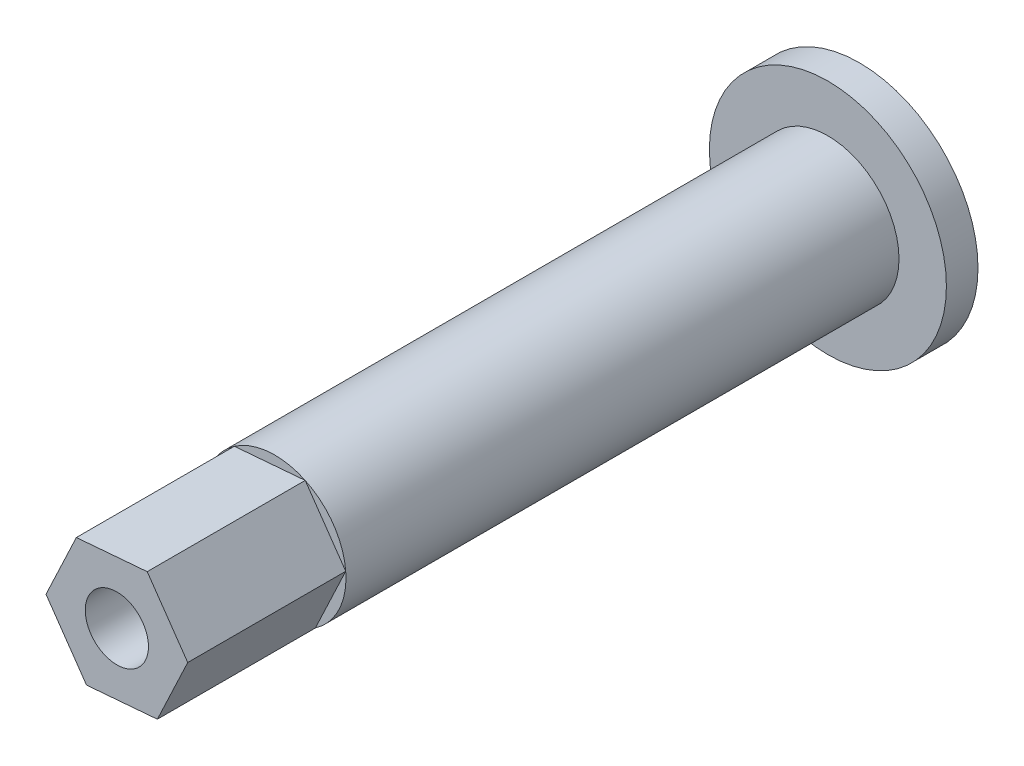
ISO-10303-21;
HEADER;
FILE_DESCRIPTION(('STEP AP214'),'2;1');
FILE_NAME('part.step','',(''),(''),'','','');
FILE_SCHEMA(('AUTOMOTIVE_DESIGN { 1 0 10303 214 1 1 1 1 }'));
ENDSEC;
DATA;
#1=APPLICATION_CONTEXT('core data for automotive mechanical design processes');
#2=APPLICATION_PROTOCOL_DEFINITION('international standard','automotive_design',2000,#1);
#3=PRODUCT_CONTEXT('',#1,'mechanical');
#4=PRODUCT('Part','Part','',(#3));
#5=PRODUCT_RELATED_PRODUCT_CATEGORY('part','',(#4));
#6=PRODUCT_DEFINITION_FORMATION('','',#4);
#7=PRODUCT_DEFINITION_CONTEXT('part definition',#1,'design');
#8=PRODUCT_DEFINITION('design','',#6,#7);
#9=PRODUCT_DEFINITION_SHAPE('','',#8);
#10=(LENGTH_UNIT() NAMED_UNIT(*) SI_UNIT(.MILLI.,.METRE.));
#11=(NAMED_UNIT(*) PLANE_ANGLE_UNIT() SI_UNIT($,.RADIAN.));
#12=(NAMED_UNIT(*) SI_UNIT($,.STERADIAN.) SOLID_ANGLE_UNIT());
#13=UNCERTAINTY_MEASURE_WITH_UNIT(LENGTH_MEASURE(1.E-05),#10,'distance_accuracy_value','');
#14=(GEOMETRIC_REPRESENTATION_CONTEXT(3) GLOBAL_UNCERTAINTY_ASSIGNED_CONTEXT((#13)) GLOBAL_UNIT_ASSIGNED_CONTEXT((#10,
#11,#12)) REPRESENTATION_CONTEXT('',''));
#15=CARTESIAN_POINT('',(0.,0.,0.));
#16=DIRECTION('',(0.,0.,1.));
#17=DIRECTION('',(1.,0.,0.));
#18=AXIS2_PLACEMENT_3D('',#15,#16,#17);
#19=CARTESIAN_POINT('',(0.,0.,35.));
#20=DIRECTION('',(0.,0.,1.));
#21=DIRECTION('',(1.,0.,0.));
#22=AXIS2_PLACEMENT_3D('',#19,#20,#21);
#23=PLANE('',#22);
#24=DIRECTION('',(-0.569748496318656,0.821819110840476,0.));
#25=VECTOR('',#24,1.);
#26=CARTESIAN_POINT('',(4.48465713958224,0.371282022718662,35.));
#27=LINE('',#26,#25);
#28=CARTESIAN_POINT('',(4.48465713958224,0.371282022718665,35.));
#29=VERTEX_POINT('',#28);
#30=CARTESIAN_POINT('',(1.92078890614829,4.0694680215008,35.));
#31=VERTEX_POINT('',#30);
#32=EDGE_CURVE('E147',#29,#31,#27,.T.);
#33=ORIENTED_EDGE('',*,*,#32,.F.);
#34=CARTESIAN_POINT('',(0.,0.,35.));
#35=DIRECTION('',(0.,0.,1.));
#36=DIRECTION('',(1.,0.,0.));
#37=AXIS2_PLACEMENT_3D('',#34,#35,#36);
#38=CIRCLE('',#37,4.5);
#39=EDGE_CURVE('E155',#29,#31,#38,.T.);
#40=ORIENTED_EDGE('',*,*,#39,.T.);
#41=EDGE_LOOP('',(#33,#40));
#42=FACE_BOUND('',#41,.T.);
#43=ADVANCED_FACE('F43',(#42),#23,.T.);
#44=DIRECTION('',(0.426841979144064,0.904326227000179,0.));
#45=VECTOR('',#44,1.);
#46=CARTESIAN_POINT('',(2.56386823343395,-3.69818599878214,35.));
#47=LINE('',#46,#45);
#48=CARTESIAN_POINT('',(2.56386823343395,-3.69818599878214,35.));
#49=VERTEX_POINT('',#48);
#50=EDGE_CURVE('E58',#49,#29,#47,.T.);
#51=ORIENTED_EDGE('',*,*,#50,.F.);
#52=EDGE_CURVE('E149',#49,#29,#38,.T.);
#53=ORIENTED_EDGE('',*,*,#52,.T.);
#54=EDGE_LOOP('',(#51,#53));
#55=FACE_BOUND('',#54,.T.);
#56=ADVANCED_FACE('F243',(#55),#23,.T.);
#57=DIRECTION('',(0.99659047546272,0.0825071161597027,0.));
#58=VECTOR('',#57,1.);
#59=CARTESIAN_POINT('',(-1.92078890614828,-4.0694680215008,35.));
#60=LINE('',#59,#58);
#61=CARTESIAN_POINT('',(-1.92078890614828,-4.06946802150081,35.));
#62=VERTEX_POINT('',#61);
#63=EDGE_CURVE('E65',#62,#49,#60,.T.);
#64=ORIENTED_EDGE('',*,*,#63,.F.);
#65=EDGE_CURVE('E153',#62,#49,#38,.T.);
#66=ORIENTED_EDGE('',*,*,#65,.T.);
#67=EDGE_LOOP('',(#64,#66));
#68=FACE_BOUND('',#67,.T.);
#69=ADVANCED_FACE('F248',(#68),#23,.T.);
#70=DIRECTION('',(0.569748496318656,-0.821819110840476,0.));
#71=VECTOR('',#70,1.);
#72=CARTESIAN_POINT('',(-4.48465713958223,-0.371282022718662,35.));
#73=LINE('',#72,#71);
#74=CARTESIAN_POINT('',(-4.48465713958224,-0.371282022718668,35.));
#75=VERTEX_POINT('',#74);
#76=EDGE_CURVE('E288',#75,#62,#73,.T.);
#77=ORIENTED_EDGE('',*,*,#76,.F.);
#78=EDGE_CURVE('E277',#75,#62,#38,.T.);
#79=ORIENTED_EDGE('',*,*,#78,.T.);
#80=EDGE_LOOP('',(#77,#79));
#81=FACE_BOUND('',#80,.T.);
#82=ADVANCED_FACE('F238',(#81),#23,.T.);
#83=DIRECTION('',(-0.426841979144064,-0.904326227000179,0.));
#84=VECTOR('',#83,1.);
#85=CARTESIAN_POINT('',(-2.56386823343395,3.69818599878214,35.));
#86=LINE('',#85,#84);
#87=CARTESIAN_POINT('',(-2.56386823343395,3.69818599878214,35.));
#88=VERTEX_POINT('',#87);
#89=EDGE_CURVE('E262',#88,#75,#86,.T.);
#90=ORIENTED_EDGE('',*,*,#89,.F.);
#91=EDGE_CURVE('E269',#88,#75,#38,.T.);
#92=ORIENTED_EDGE('',*,*,#91,.T.);
#93=EDGE_LOOP('',(#90,#92));
#94=FACE_BOUND('',#93,.T.);
#95=ADVANCED_FACE('F233',(#94),#23,.T.);
#96=CARTESIAN_POINT('',(0.,0.,10.));
#97=DIRECTION('',(0.,0.,-1.));
#98=DIRECTION('',(-1.,0.,0.));
#99=AXIS2_PLACEMENT_3D('',#96,#97,#98);
#100=CYLINDRICAL_SURFACE('',#99,2.7);
#101=DIRECTION('',(0.,0.,-1.));
#102=VECTOR('',#101,1.);
#103=CARTESIAN_POINT('',(-1.85,1.96659604392971,10.));
#104=LINE('',#103,#102);
#105=CARTESIAN_POINT('',(-1.85,1.96659604392971,10.));
#106=VERTEX_POINT('',#105);
#107=CARTESIAN_POINT('',(-1.85,1.96659604392971,-2.));
#108=VERTEX_POINT('',#107);
#109=EDGE_CURVE('E201',#106,#108,#104,.T.);
#110=ORIENTED_EDGE('',*,*,#109,.T.);
#111=CARTESIAN_POINT('',(0.,0.,-2.));
#112=DIRECTION('',(0.,0.,-1.));
#113=DIRECTION('',(-1.,0.,0.));
#114=AXIS2_PLACEMENT_3D('',#111,#112,#113);
#115=CIRCLE('',#114,2.7);
#116=CARTESIAN_POINT('',(1.85,1.96659604392972,-2.));
#117=VERTEX_POINT('',#116);
#118=EDGE_CURVE('E162',#108,#117,#115,.T.);
#119=ORIENTED_EDGE('',*,*,#118,.T.);
#120=DIRECTION('',(0.,0.,-1.));
#121=VECTOR('',#120,1.);
#122=CARTESIAN_POINT('',(1.85,1.96659604392972,10.));
#123=LINE('',#122,#121);
#124=CARTESIAN_POINT('',(1.85,1.96659604392972,10.));
#125=VERTEX_POINT('',#124);
#126=EDGE_CURVE('E11',#125,#117,#123,.T.);
#127=ORIENTED_EDGE('',*,*,#126,.F.);
#128=CARTESIAN_POINT('',(0.,0.,10.));
#129=DIRECTION('',(0.,0.,1.));
#130=DIRECTION('',(1.,0.,0.));
#131=AXIS2_PLACEMENT_3D('',#128,#129,#130);
#132=CIRCLE('',#131,2.7);
#133=EDGE_CURVE('E188',#106,#125,#132,.F.);
#134=ORIENTED_EDGE('',*,*,#133,.F.);
#135=EDGE_LOOP('',(#110,#119,#127,#134));
#136=FACE_BOUND('',#135,.T.);
#137=ADVANCED_FACE('F45',(#136),#100,.F.);
#138=CARTESIAN_POINT('',(1.85,0.,10.));
#139=DIRECTION('',(1.,0.,0.));
#140=DIRECTION('',(0.,0.,-1.));
#141=AXIS2_PLACEMENT_3D('',#138,#139,#140);
#142=PLANE('',#141);
#143=ORIENTED_EDGE('',*,*,#126,.T.);
#144=DIRECTION('',(0.,-1.,0.));
#145=VECTOR('',#144,1.);
#146=CARTESIAN_POINT('',(1.85,1.96659604392972,-2.));
#147=LINE('',#146,#145);
#148=CARTESIAN_POINT('',(1.85,-1.96659604392972,-2.));
#149=VERTEX_POINT('',#148);
#150=EDGE_CURVE('E167',#117,#149,#147,.T.);
#151=ORIENTED_EDGE('',*,*,#150,.T.);
#152=DIRECTION('',(0.,0.,-1.));
#153=VECTOR('',#152,1.);
#154=CARTESIAN_POINT('',(1.85,-1.96659604392972,10.));
#155=LINE('',#154,#153);
#156=CARTESIAN_POINT('',(1.85,-1.96659604392972,10.));
#157=VERTEX_POINT('',#156);
#158=EDGE_CURVE('E52',#157,#149,#155,.T.);
#159=ORIENTED_EDGE('',*,*,#158,.F.);
#160=DIRECTION('',(0.,-1.,0.));
#161=VECTOR('',#160,1.);
#162=CARTESIAN_POINT('',(1.85,0.,10.));
#163=LINE('',#162,#161);
#164=EDGE_CURVE('E191',#125,#157,#163,.T.);
#165=ORIENTED_EDGE('',*,*,#164,.F.);
#166=EDGE_LOOP('',(#143,#151,#159,#165));
#167=FACE_BOUND('',#166,.T.);
#168=ADVANCED_FACE('F220',(#167),#142,.F.);
#169=CARTESIAN_POINT('',(0.,0.,10.));
#170=DIRECTION('',(0.,0.,-1.));
#171=DIRECTION('',(-1.,0.,0.));
#172=AXIS2_PLACEMENT_3D('',#169,#170,#171);
#173=CYLINDRICAL_SURFACE('',#172,2.7);
#174=ORIENTED_EDGE('',*,*,#158,.T.);
#175=CARTESIAN_POINT('',(0.,0.,-2.));
#176=DIRECTION('',(0.,0.,-1.));
#177=DIRECTION('',(-1.,0.,0.));
#178=AXIS2_PLACEMENT_3D('',#175,#176,#177);
#179=CIRCLE('',#178,2.7);
#180=CARTESIAN_POINT('',(-1.85,-1.96659604392971,-2.));
#181=VERTEX_POINT('',#180);
#182=EDGE_CURVE('E171',#149,#181,#179,.T.);
#183=ORIENTED_EDGE('',*,*,#182,.T.);
#184=DIRECTION('',(0.,0.,-1.));
#185=VECTOR('',#184,1.);
#186=CARTESIAN_POINT('',(-1.85,-1.96659604392971,10.));
#187=LINE('',#186,#185);
#188=CARTESIAN_POINT('',(-1.85,-1.96659604392971,10.));
#189=VERTEX_POINT('',#188);
#190=EDGE_CURVE('E207',#189,#181,#187,.T.);
#191=ORIENTED_EDGE('',*,*,#190,.F.);
#192=CARTESIAN_POINT('',(0.,0.,10.));
#193=DIRECTION('',(0.,0.,1.));
#194=DIRECTION('',(1.,0.,0.));
#195=AXIS2_PLACEMENT_3D('',#192,#193,#194);
#196=CIRCLE('',#195,2.7);
#197=EDGE_CURVE('E194',#157,#189,#196,.F.);
#198=ORIENTED_EDGE('',*,*,#197,.F.);
#199=EDGE_LOOP('',(#174,#183,#191,#198));
#200=FACE_BOUND('',#199,.T.);
#201=ADVANCED_FACE('F213',(#200),#173,.F.);
#202=CARTESIAN_POINT('',(-1.85,0.,10.));
#203=DIRECTION('',(1.,0.,0.));
#204=DIRECTION('',(0.,0.,-1.));
#205=AXIS2_PLACEMENT_3D('',#202,#203,#204);
#206=PLANE('',#205);
#207=ORIENTED_EDGE('',*,*,#190,.T.);
#208=DIRECTION('',(0.,1.,0.));
#209=VECTOR('',#208,1.);
#210=CARTESIAN_POINT('',(-1.85,1.96659604392971,-2.));
#211=LINE('',#210,#209);
#212=EDGE_CURVE('E175',#181,#108,#211,.T.);
#213=ORIENTED_EDGE('',*,*,#212,.T.);
#214=ORIENTED_EDGE('',*,*,#109,.F.);
#215=DIRECTION('',(0.,-1.,0.));
#216=VECTOR('',#215,1.);
#217=CARTESIAN_POINT('',(-1.85,0.,10.));
#218=LINE('',#217,#216);
#219=EDGE_CURVE('E197',#106,#189,#218,.T.);
#220=ORIENTED_EDGE('',*,*,#219,.T.);
#221=EDGE_LOOP('',(#207,#213,#214,#220));
#222=FACE_BOUND('',#221,.T.);
#223=ADVANCED_FACE('F227',(#222),#206,.T.);
#224=CARTESIAN_POINT('',(0.,0.,10.));
#225=DIRECTION('',(0.,0.,-1.));
#226=DIRECTION('',(-1.,0.,0.));
#227=AXIS2_PLACEMENT_3D('',#224,#225,#226);
#228=CYLINDRICAL_SURFACE('',#227,4.5);
#229=CARTESIAN_POINT('',(0.,0.,0.));
#230=DIRECTION('',(0.,0.,1.));
#231=DIRECTION('',(1.,0.,0.));
#232=AXIS2_PLACEMENT_3D('',#229,#230,#231);
#233=CIRCLE('',#232,4.5);
#234=CARTESIAN_POINT('',(4.5,0.,0.));
#235=VERTEX_POINT('',#234);
#236=EDGE_CURVE('E184',#235,#235,#233,.T.);
#237=ORIENTED_EDGE('',*,*,#236,.T.);
#238=EDGE_LOOP('',(#237));
#239=FACE_BOUND('',#238,.T.);
#240=ORIENTED_EDGE('',*,*,#39,.F.);
#241=ORIENTED_EDGE('',*,*,#52,.F.);
#242=ORIENTED_EDGE('',*,*,#65,.F.);
#243=ORIENTED_EDGE('',*,*,#78,.F.);
#244=ORIENTED_EDGE('',*,*,#91,.F.);
#245=EDGE_CURVE('E163',#31,#88,#38,.T.);
#246=ORIENTED_EDGE('',*,*,#245,.F.);
#247=EDGE_LOOP('',(#240,#241,#242,#243,#244,#246));
#248=FACE_BOUND('',#247,.T.);
#249=ADVANCED_FACE('F266',(#239,#248),#228,.T.);
#250=CARTESIAN_POINT('',(0.,0.,-2.));
#251=DIRECTION('',(0.,0.,-1.));
#252=DIRECTION('',(-1.,0.,0.));
#253=AXIS2_PLACEMENT_3D('',#250,#251,#252);
#254=PLANE('',#253);
#255=CARTESIAN_POINT('',(0.,0.,-2.));
#256=DIRECTION('',(0.,0.,-1.));
#257=DIRECTION('',(-1.,0.,0.));
#258=AXIS2_PLACEMENT_3D('',#255,#256,#257);
#259=CIRCLE('',#258,7.5);
#260=CARTESIAN_POINT('',(-7.5,0.,-2.));
#261=VERTEX_POINT('',#260);
#262=EDGE_CURVE('E180',#261,#261,#259,.T.);
#263=ORIENTED_EDGE('',*,*,#262,.T.);
#264=EDGE_LOOP('',(#263));
#265=FACE_BOUND('',#264,.T.);
#266=ORIENTED_EDGE('',*,*,#150,.F.);
#267=ORIENTED_EDGE('',*,*,#118,.F.);
#268=ORIENTED_EDGE('',*,*,#212,.F.);
#269=ORIENTED_EDGE('',*,*,#182,.F.);
#270=EDGE_LOOP('',(#266,#267,#268,#269));
#271=FACE_BOUND('',#270,.T.);
#272=ADVANCED_FACE('F224',(#265,#271),#254,.T.);
#273=CARTESIAN_POINT('',(0.,0.,0.));
#274=DIRECTION('',(0.,0.,-1.));
#275=DIRECTION('',(-1.,0.,0.));
#276=AXIS2_PLACEMENT_3D('',#273,#274,#275);
#277=PLANE('',#276);
#278=ORIENTED_EDGE('',*,*,#236,.F.);
#279=EDGE_LOOP('',(#278));
#280=FACE_BOUND('',#279,.T.);
#281=CARTESIAN_POINT('',(0.,0.,0.));
#282=DIRECTION('',(0.,0.,-1.));
#283=DIRECTION('',(-1.,0.,0.));
#284=AXIS2_PLACEMENT_3D('',#281,#282,#283);
#285=CIRCLE('',#284,7.5);
#286=CARTESIAN_POINT('',(-7.5,0.,0.));
#287=VERTEX_POINT('',#286);
#288=EDGE_CURVE('E179',#287,#287,#285,.T.);
#289=ORIENTED_EDGE('',*,*,#288,.F.);
#290=EDGE_LOOP('',(#289));
#291=FACE_BOUND('',#290,.T.);
#292=ADVANCED_FACE('F480',(#280,#291),#277,.F.);
#293=CARTESIAN_POINT('',(0.,0.,-2.));
#294=DIRECTION('',(0.,0.,1.));
#295=DIRECTION('',(1.,0.,0.));
#296=AXIS2_PLACEMENT_3D('',#293,#294,#295);
#297=CYLINDRICAL_SURFACE('',#296,7.5);
#298=ORIENTED_EDGE('',*,*,#262,.F.);
#299=EDGE_LOOP('',(#298));
#300=FACE_BOUND('',#299,.T.);
#301=ORIENTED_EDGE('',*,*,#288,.T.);
#302=EDGE_LOOP('',(#301));
#303=FACE_BOUND('',#302,.T.);
#304=ADVANCED_FACE('F257',(#300,#303),#297,.T.);
#305=CARTESIAN_POINT('',(0.,0.,10.));
#306=DIRECTION('',(0.,0.,1.));
#307=DIRECTION('',(1.,0.,0.));
#308=AXIS2_PLACEMENT_3D('',#305,#306,#307);
#309=PLANE('',#308);
#310=ORIENTED_EDGE('',*,*,#219,.F.);
#311=ORIENTED_EDGE('',*,*,#133,.T.);
#312=ORIENTED_EDGE('',*,*,#164,.T.);
#313=ORIENTED_EDGE('',*,*,#197,.T.);
#314=EDGE_LOOP('',(#310,#311,#312,#313));
#315=FACE_BOUND('',#314,.T.);
#316=ADVANCED_FACE('F230',(#315),#309,.F.);
#317=DIRECTION('',(-0.99659047546272,-0.0825071161597025,0.));
#318=VECTOR('',#317,1.);
#319=CARTESIAN_POINT('',(1.92078890614829,4.0694680215008,35.));
#320=LINE('',#319,#318);
#321=EDGE_CURVE('E258',#31,#88,#320,.T.);
#322=ORIENTED_EDGE('',*,*,#321,.F.);
#323=ORIENTED_EDGE('',*,*,#245,.T.);
#324=EDGE_LOOP('',(#322,#323));
#325=FACE_BOUND('',#324,.T.);
#326=ADVANCED_FACE('F241',(#325),#23,.T.);
#327=CARTESIAN_POINT('',(4.48465713958224,0.371282022718662,45.));
#328=DIRECTION('',(-0.821819110840476,-0.569748496318656,0.));
#329=DIRECTION('',(0.569748496318656,-0.821819110840476,0.));
#330=AXIS2_PLACEMENT_3D('',#327,#328,#329);
#331=PLANE('',#330);
#332=ORIENTED_EDGE('',*,*,#32,.T.);
#333=DIRECTION('',(0.,0.,-1.));
#334=VECTOR('',#333,1.);
#335=CARTESIAN_POINT('',(1.92078890614829,4.0694680215008,45.));
#336=LINE('',#335,#334);
#337=CARTESIAN_POINT('',(1.92078890614829,4.0694680215008,45.));
#338=VERTEX_POINT('',#337);
#339=EDGE_CURVE('E127',#338,#31,#336,.T.);
#340=ORIENTED_EDGE('',*,*,#339,.F.);
#341=DIRECTION('',(-0.569748496318656,0.821819110840476,0.));
#342=VECTOR('',#341,1.);
#343=CARTESIAN_POINT('',(4.48465713958224,0.371282022718662,45.));
#344=LINE('',#343,#342);
#345=CARTESIAN_POINT('',(4.48465713958224,0.371282022718662,45.));
#346=VERTEX_POINT('',#345);
#347=EDGE_CURVE('E135',#346,#338,#344,.T.);
#348=ORIENTED_EDGE('',*,*,#347,.F.);
#349=DIRECTION('',(0.,0.,-1.));
#350=VECTOR('',#349,1.);
#351=CARTESIAN_POINT('',(4.48465713958224,0.371282022718662,45.));
#352=LINE('',#351,#350);
#353=EDGE_CURVE('E293',#346,#29,#352,.T.);
#354=ORIENTED_EDGE('',*,*,#353,.T.);
#355=EDGE_LOOP('',(#332,#340,#348,#354));
#356=FACE_BOUND('',#355,.T.);
#357=ADVANCED_FACE('F146',(#356),#331,.F.);
#358=CARTESIAN_POINT('',(1.92078890614829,4.0694680215008,45.));
#359=DIRECTION('',(0.0825071161597025,-0.99659047546272,0.));
#360=DIRECTION('',(0.99659047546272,0.0825071161597025,0.));
#361=AXIS2_PLACEMENT_3D('',#358,#359,#360);
#362=PLANE('',#361);
#363=ORIENTED_EDGE('',*,*,#321,.T.);
#364=DIRECTION('',(0.,0.,-1.));
#365=VECTOR('',#364,1.);
#366=CARTESIAN_POINT('',(-2.56386823343395,3.69818599878214,45.));
#367=LINE('',#366,#365);
#368=CARTESIAN_POINT('',(-2.56386823343395,3.69818599878214,45.));
#369=VERTEX_POINT('',#368);
#370=EDGE_CURVE('E130',#369,#88,#367,.T.);
#371=ORIENTED_EDGE('',*,*,#370,.F.);
#372=DIRECTION('',(-0.99659047546272,-0.0825071161597025,0.));
#373=VECTOR('',#372,1.);
#374=CARTESIAN_POINT('',(1.92078890614829,4.0694680215008,45.));
#375=LINE('',#374,#373);
#376=EDGE_CURVE('E122',#338,#369,#375,.T.);
#377=ORIENTED_EDGE('',*,*,#376,.F.);
#378=ORIENTED_EDGE('',*,*,#339,.T.);
#379=EDGE_LOOP('',(#363,#371,#377,#378));
#380=FACE_BOUND('',#379,.T.);
#381=ADVANCED_FACE('F125',(#380),#362,.F.);
#382=CARTESIAN_POINT('',(-2.56386823343395,3.69818599878214,45.));
#383=DIRECTION('',(0.904326227000179,-0.426841979144063,0.));
#384=DIRECTION('',(0.426841979144063,0.904326227000179,0.));
#385=AXIS2_PLACEMENT_3D('',#382,#383,#384);
#386=PLANE('',#385);
#387=ORIENTED_EDGE('',*,*,#89,.T.);
#388=DIRECTION('',(0.,0.,-1.));
#389=VECTOR('',#388,1.);
#390=CARTESIAN_POINT('',(-4.48465713958223,-0.371282022718662,45.));
#391=LINE('',#390,#389);
#392=CARTESIAN_POINT('',(-4.48465713958223,-0.371282022718662,45.));
#393=VERTEX_POINT('',#392);
#394=EDGE_CURVE('E156',#393,#75,#391,.T.);
#395=ORIENTED_EDGE('',*,*,#394,.F.);
#396=DIRECTION('',(-0.426841979144064,-0.904326227000179,0.));
#397=VECTOR('',#396,1.);
#398=CARTESIAN_POINT('',(-2.56386823343395,3.69818599878214,45.));
#399=LINE('',#398,#397);
#400=EDGE_CURVE('E134',#369,#393,#399,.T.);
#401=ORIENTED_EDGE('',*,*,#400,.F.);
#402=ORIENTED_EDGE('',*,*,#370,.T.);
#403=EDGE_LOOP('',(#387,#395,#401,#402));
#404=FACE_BOUND('',#403,.T.);
#405=ADVANCED_FACE('F310',(#404),#386,.F.);
#406=CARTESIAN_POINT('',(-4.48465713958223,-0.371282022718662,45.));
#407=DIRECTION('',(0.821819110840476,0.569748496318656,0.));
#408=DIRECTION('',(-0.569748496318656,0.821819110840476,0.));
#409=AXIS2_PLACEMENT_3D('',#406,#407,#408);
#410=PLANE('',#409);
#411=ORIENTED_EDGE('',*,*,#76,.T.);
#412=DIRECTION('',(0.,0.,-1.));
#413=VECTOR('',#412,1.);
#414=CARTESIAN_POINT('',(-1.92078890614828,-4.0694680215008,45.));
#415=LINE('',#414,#413);
#416=CARTESIAN_POINT('',(-1.92078890614828,-4.0694680215008,45.));
#417=VERTEX_POINT('',#416);
#418=EDGE_CURVE('E286',#417,#62,#415,.T.);
#419=ORIENTED_EDGE('',*,*,#418,.F.);
#420=DIRECTION('',(0.569748496318656,-0.821819110840476,0.));
#421=VECTOR('',#420,1.);
#422=CARTESIAN_POINT('',(-4.48465713958223,-0.371282022718662,45.));
#423=LINE('',#422,#421);
#424=EDGE_CURVE('E307',#393,#417,#423,.T.);
#425=ORIENTED_EDGE('',*,*,#424,.F.);
#426=ORIENTED_EDGE('',*,*,#394,.T.);
#427=EDGE_LOOP('',(#411,#419,#425,#426));
#428=FACE_BOUND('',#427,.T.);
#429=ADVANCED_FACE('F306',(#428),#410,.F.);
#430=CARTESIAN_POINT('',(-1.92078890614828,-4.0694680215008,45.));
#431=DIRECTION('',(-0.0825071161597027,0.99659047546272,0.));
#432=DIRECTION('',(-0.99659047546272,-0.0825071161597027,0.));
#433=AXIS2_PLACEMENT_3D('',#430,#431,#432);
#434=PLANE('',#433);
#435=ORIENTED_EDGE('',*,*,#63,.T.);
#436=DIRECTION('',(0.,0.,-1.));
#437=VECTOR('',#436,1.);
#438=CARTESIAN_POINT('',(2.56386823343395,-3.69818599878214,45.));
#439=LINE('',#438,#437);
#440=CARTESIAN_POINT('',(2.56386823343395,-3.69818599878214,45.));
#441=VERTEX_POINT('',#440);
#442=EDGE_CURVE('E284',#441,#49,#439,.T.);
#443=ORIENTED_EDGE('',*,*,#442,.F.);
#444=DIRECTION('',(0.99659047546272,0.0825071161597027,0.));
#445=VECTOR('',#444,1.);
#446=CARTESIAN_POINT('',(-1.92078890614828,-4.0694680215008,45.));
#447=LINE('',#446,#445);
#448=EDGE_CURVE('E320',#417,#441,#447,.T.);
#449=ORIENTED_EDGE('',*,*,#448,.F.);
#450=ORIENTED_EDGE('',*,*,#418,.T.);
#451=EDGE_LOOP('',(#435,#443,#449,#450));
#452=FACE_BOUND('',#451,.T.);
#453=ADVANCED_FACE('F282',(#452),#434,.F.);
#454=CARTESIAN_POINT('',(2.56386823343395,-3.69818599878214,45.));
#455=DIRECTION('',(-0.904326227000179,0.426841979144064,0.));
#456=DIRECTION('',(-0.426841979144064,-0.904326227000179,0.));
#457=AXIS2_PLACEMENT_3D('',#454,#455,#456);
#458=PLANE('',#457);
#459=ORIENTED_EDGE('',*,*,#50,.T.);
#460=ORIENTED_EDGE('',*,*,#353,.F.);
#461=DIRECTION('',(0.426841979144064,0.904326227000179,0.));
#462=VECTOR('',#461,1.);
#463=CARTESIAN_POINT('',(2.56386823343395,-3.69818599878214,45.));
#464=LINE('',#463,#462);
#465=EDGE_CURVE('E140',#441,#346,#464,.T.);
#466=ORIENTED_EDGE('',*,*,#465,.F.);
#467=ORIENTED_EDGE('',*,*,#442,.T.);
#468=EDGE_LOOP('',(#459,#460,#466,#467));
#469=FACE_BOUND('',#468,.T.);
#470=ADVANCED_FACE('F291',(#469),#458,.F.);
#471=CARTESIAN_POINT('',(0.,0.,45.));
#472=DIRECTION('',(0.,0.,1.));
#473=DIRECTION('',(1.,0.,0.));
#474=AXIS2_PLACEMENT_3D('',#471,#472,#473);
#475=PLANE('',#474);
#476=CARTESIAN_POINT('',(0.,0.,45.));
#477=DIRECTION('',(0.,0.,1.));
#478=DIRECTION('',(1.,0.,0.));
#479=AXIS2_PLACEMENT_3D('',#476,#477,#478);
#480=CIRCLE('',#479,2.);
#481=CARTESIAN_POINT('',(2.,0.,45.));
#482=VERTEX_POINT('',#481);
#483=EDGE_CURVE('E326',#482,#482,#480,.T.);
#484=ORIENTED_EDGE('',*,*,#483,.F.);
#485=EDGE_LOOP('',(#484));
#486=FACE_BOUND('',#485,.T.);
#487=ORIENTED_EDGE('',*,*,#347,.T.);
#488=ORIENTED_EDGE('',*,*,#376,.T.);
#489=ORIENTED_EDGE('',*,*,#400,.T.);
#490=ORIENTED_EDGE('',*,*,#424,.T.);
#491=ORIENTED_EDGE('',*,*,#448,.T.);
#492=ORIENTED_EDGE('',*,*,#465,.T.);
#493=EDGE_LOOP('',(#487,#488,#489,#490,#491,#492));
#494=FACE_BOUND('',#493,.T.);
#495=ADVANCED_FACE('F138',(#486,#494),#475,.T.);
#496=CARTESIAN_POINT('',(0.,0.,39.));
#497=DIRECTION('',(0.,0.,1.));
#498=DIRECTION('',(1.,0.,0.));
#499=AXIS2_PLACEMENT_3D('',#496,#497,#498);
#500=CYLINDRICAL_SURFACE('',#499,2.);
#501=CARTESIAN_POINT('',(0.,0.,39.));
#502=DIRECTION('',(0.,0.,1.));
#503=DIRECTION('',(1.,0.,0.));
#504=AXIS2_PLACEMENT_3D('',#501,#502,#503);
#505=CIRCLE('',#504,2.);
#506=CARTESIAN_POINT('',(2.,0.,39.));
#507=VERTEX_POINT('',#506);
#508=EDGE_CURVE('E273',#507,#507,#505,.T.);
#509=ORIENTED_EDGE('',*,*,#508,.F.);
#510=EDGE_LOOP('',(#509));
#511=FACE_BOUND('',#510,.T.);
#512=ORIENTED_EDGE('',*,*,#483,.T.);
#513=EDGE_LOOP('',(#512));
#514=FACE_BOUND('',#513,.T.);
#515=ADVANCED_FACE('F336',(#511,#514),#500,.F.);
#516=CARTESIAN_POINT('',(0.,0.,39.));
#517=DIRECTION('',(0.,0.,1.));
#518=DIRECTION('',(1.,0.,0.));
#519=AXIS2_PLACEMENT_3D('',#516,#517,#518);
#520=PLANE('',#519);
#521=ORIENTED_EDGE('',*,*,#508,.T.);
#522=EDGE_LOOP('',(#521));
#523=FACE_BOUND('',#522,.T.);
#524=ADVANCED_FACE('F334',(#523),#520,.T.);
#525=CLOSED_SHELL('',(#43,#56,#69,#82,#95,#137,#168,#201,#223,#249,#272,#292,#304,#316,#326,
#357,#381,#405,#429,#453,#470,#495,#515,#524));
#526=MANIFOLD_SOLID_BREP('B2',#525);
#527=ADVANCED_BREP_SHAPE_REPRESENTATION('',(#18,#526),#14);
#528=SHAPE_DEFINITION_REPRESENTATION(#9,#527);
ENDSEC;
END-ISO-10303-21;
